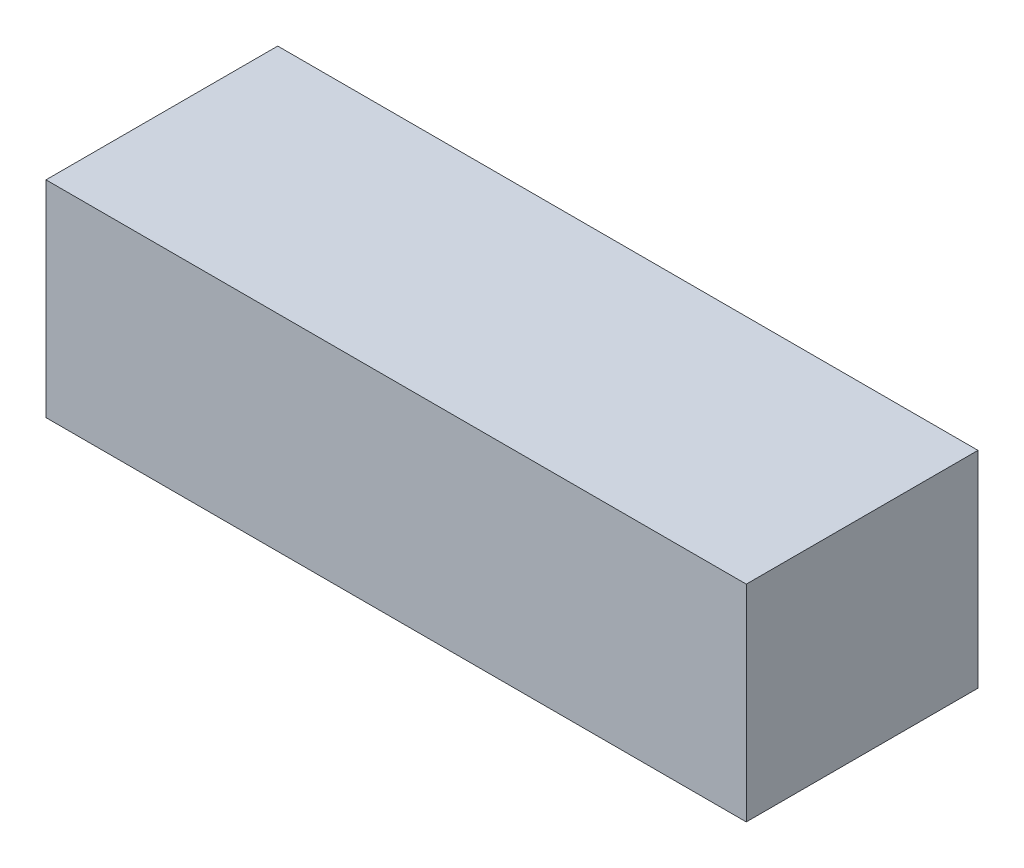
ISO-10303-21;
HEADER;
FILE_DESCRIPTION(('STEP AP214'),'2;1');
FILE_NAME('part.step','',(''),(''),'','','');
FILE_SCHEMA(('AUTOMOTIVE_DESIGN { 1 0 10303 214 1 1 1 1 }'));
ENDSEC;
DATA;
#1=APPLICATION_CONTEXT('core data for automotive mechanical design processes');
#2=APPLICATION_PROTOCOL_DEFINITION('international standard','automotive_design',2000,#1);
#3=PRODUCT_CONTEXT('',#1,'mechanical');
#4=PRODUCT('Part','Part','',(#3));
#5=PRODUCT_RELATED_PRODUCT_CATEGORY('part','',(#4));
#6=PRODUCT_DEFINITION_FORMATION('','',#4);
#7=PRODUCT_DEFINITION_CONTEXT('part definition',#1,'design');
#8=PRODUCT_DEFINITION('design','',#6,#7);
#9=PRODUCT_DEFINITION_SHAPE('','',#8);
#10=(LENGTH_UNIT() NAMED_UNIT(*) SI_UNIT(.MILLI.,.METRE.));
#11=(NAMED_UNIT(*) PLANE_ANGLE_UNIT() SI_UNIT($,.RADIAN.));
#12=(NAMED_UNIT(*) SI_UNIT($,.STERADIAN.) SOLID_ANGLE_UNIT());
#13=UNCERTAINTY_MEASURE_WITH_UNIT(LENGTH_MEASURE(1.E-05),#10,'distance_accuracy_value','');
#14=(GEOMETRIC_REPRESENTATION_CONTEXT(3) GLOBAL_UNCERTAINTY_ASSIGNED_CONTEXT((#13)) GLOBAL_UNIT_ASSIGNED_CONTEXT((#10,
#11,#12)) REPRESENTATION_CONTEXT('',''));
#15=CARTESIAN_POINT('',(0.,0.,0.));
#16=DIRECTION('',(0.,0.,1.));
#17=DIRECTION('',(1.,0.,0.));
#18=AXIS2_PLACEMENT_3D('',#15,#16,#17);
#19=CARTESIAN_POINT('',(-68.,20.,45.));
#20=DIRECTION('',(1.,0.,0.));
#21=DIRECTION('',(0.,0.,-1.));
#22=AXIS2_PLACEMENT_3D('',#19,#20,#21);
#23=PLANE('',#22);
#24=DIRECTION('',(0.,-1.,0.));
#25=VECTOR('',#24,1.);
#26=CARTESIAN_POINT('',(-68.,20.,0.));
#27=LINE('',#26,#25);
#28=CARTESIAN_POINT('',(-68.,20.,0.));
#29=VERTEX_POINT('',#28);
#30=CARTESIAN_POINT('',(-68.,-20.,0.));
#31=VERTEX_POINT('',#30);
#32=EDGE_CURVE('E96',#29,#31,#27,.T.);
#33=ORIENTED_EDGE('',*,*,#32,.T.);
#34=DIRECTION('',(0.,0.,-1.));
#35=VECTOR('',#34,1.);
#36=CARTESIAN_POINT('',(-68.,-20.,45.));
#37=LINE('',#36,#35);
#38=CARTESIAN_POINT('',(-68.,-20.,45.));
#39=VERTEX_POINT('',#38);
#40=EDGE_CURVE('E11',#39,#31,#37,.T.);
#41=ORIENTED_EDGE('',*,*,#40,.F.);
#42=DIRECTION('',(0.,-1.,0.));
#43=VECTOR('',#42,1.);
#44=CARTESIAN_POINT('',(-68.,20.,45.));
#45=LINE('',#44,#43);
#46=CARTESIAN_POINT('',(-68.,20.,45.));
#47=VERTEX_POINT('',#46);
#48=EDGE_CURVE('E84',#47,#39,#45,.T.);
#49=ORIENTED_EDGE('',*,*,#48,.F.);
#50=DIRECTION('',(0.,0.,-1.));
#51=VECTOR('',#50,1.);
#52=CARTESIAN_POINT('',(-68.,20.,45.));
#53=LINE('',#52,#51);
#54=EDGE_CURVE('E92',#47,#29,#53,.T.);
#55=ORIENTED_EDGE('',*,*,#54,.T.);
#56=EDGE_LOOP('',(#33,#41,#49,#55));
#57=FACE_BOUND('',#56,.T.);
#58=ADVANCED_FACE('F33',(#57),#23,.F.);
#59=CARTESIAN_POINT('',(-68.,-20.,45.));
#60=DIRECTION('',(0.,1.,0.));
#61=DIRECTION('',(0.,0.,1.));
#62=AXIS2_PLACEMENT_3D('',#59,#60,#61);
#63=PLANE('',#62);
#64=DIRECTION('',(1.,0.,0.));
#65=VECTOR('',#64,1.);
#66=CARTESIAN_POINT('',(-68.,-20.,0.));
#67=LINE('',#66,#65);
#68=CARTESIAN_POINT('',(68.,-20.,0.));
#69=VERTEX_POINT('',#68);
#70=EDGE_CURVE('E88',#31,#69,#67,.T.);
#71=ORIENTED_EDGE('',*,*,#70,.T.);
#72=DIRECTION('',(0.,0.,-1.));
#73=VECTOR('',#72,1.);
#74=CARTESIAN_POINT('',(68.,-20.,45.));
#75=LINE('',#74,#73);
#76=CARTESIAN_POINT('',(68.,-20.,45.));
#77=VERTEX_POINT('',#76);
#78=EDGE_CURVE('E41',#77,#69,#75,.T.);
#79=ORIENTED_EDGE('',*,*,#78,.F.);
#80=DIRECTION('',(1.,0.,0.));
#81=VECTOR('',#80,1.);
#82=CARTESIAN_POINT('',(-68.,-20.,45.));
#83=LINE('',#82,#81);
#84=EDGE_CURVE('E79',#39,#77,#83,.T.);
#85=ORIENTED_EDGE('',*,*,#84,.F.);
#86=ORIENTED_EDGE('',*,*,#40,.T.);
#87=EDGE_LOOP('',(#71,#79,#85,#86));
#88=FACE_BOUND('',#87,.T.);
#89=ADVANCED_FACE('F87',(#88),#63,.F.);
#90=CARTESIAN_POINT('',(68.,20.,45.));
#91=DIRECTION('',(-1.,0.,0.));
#92=DIRECTION('',(0.,-1.,0.));
#93=AXIS2_PLACEMENT_3D('',#90,#91,#92);
#94=PLANE('',#93);
#95=DIRECTION('',(0.,1.,0.));
#96=VECTOR('',#95,1.);
#97=CARTESIAN_POINT('',(68.,20.,0.));
#98=LINE('',#97,#96);
#99=CARTESIAN_POINT('',(68.,20.,0.));
#100=VERTEX_POINT('',#99);
#101=EDGE_CURVE('E66',#69,#100,#98,.T.);
#102=ORIENTED_EDGE('',*,*,#101,.T.);
#103=DIRECTION('',(0.,0.,-1.));
#104=VECTOR('',#103,1.);
#105=CARTESIAN_POINT('',(68.,20.,45.));
#106=LINE('',#105,#104);
#107=CARTESIAN_POINT('',(68.,20.,45.));
#108=VERTEX_POINT('',#107);
#109=EDGE_CURVE('E89',#108,#100,#106,.T.);
#110=ORIENTED_EDGE('',*,*,#109,.F.);
#111=DIRECTION('',(0.,1.,0.));
#112=VECTOR('',#111,1.);
#113=CARTESIAN_POINT('',(68.,20.,45.));
#114=LINE('',#113,#112);
#115=EDGE_CURVE('E82',#77,#108,#114,.T.);
#116=ORIENTED_EDGE('',*,*,#115,.F.);
#117=ORIENTED_EDGE('',*,*,#78,.T.);
#118=EDGE_LOOP('',(#102,#110,#116,#117));
#119=FACE_BOUND('',#118,.T.);
#120=ADVANCED_FACE('F90',(#119),#94,.F.);
#121=CARTESIAN_POINT('',(-68.,20.,45.));
#122=DIRECTION('',(0.,-1.,0.));
#123=DIRECTION('',(0.,0.,-1.));
#124=AXIS2_PLACEMENT_3D('',#121,#122,#123);
#125=PLANE('',#124);
#126=DIRECTION('',(-1.,0.,0.));
#127=VECTOR('',#126,1.);
#128=CARTESIAN_POINT('',(-68.,20.,0.));
#129=LINE('',#128,#127);
#130=EDGE_CURVE('E72',#100,#29,#129,.T.);
#131=ORIENTED_EDGE('',*,*,#130,.T.);
#132=ORIENTED_EDGE('',*,*,#54,.F.);
#133=DIRECTION('',(-1.,0.,0.));
#134=VECTOR('',#133,1.);
#135=CARTESIAN_POINT('',(-68.,20.,45.));
#136=LINE('',#135,#134);
#137=EDGE_CURVE('E49',#108,#47,#136,.T.);
#138=ORIENTED_EDGE('',*,*,#137,.F.);
#139=ORIENTED_EDGE('',*,*,#109,.T.);
#140=EDGE_LOOP('',(#131,#132,#138,#139));
#141=FACE_BOUND('',#140,.T.);
#142=ADVANCED_FACE('F103',(#141),#125,.F.);
#143=CARTESIAN_POINT('',(0.,0.,45.));
#144=DIRECTION('',(0.,0.,1.));
#145=DIRECTION('',(1.,0.,0.));
#146=AXIS2_PLACEMENT_3D('',#143,#144,#145);
#147=PLANE('',#146);
#148=ORIENTED_EDGE('',*,*,#48,.T.);
#149=ORIENTED_EDGE('',*,*,#84,.T.);
#150=ORIENTED_EDGE('',*,*,#115,.T.);
#151=ORIENTED_EDGE('',*,*,#137,.T.);
#152=EDGE_LOOP('',(#148,#149,#150,#151));
#153=FACE_BOUND('',#152,.T.);
#154=ADVANCED_FACE('F80',(#153),#147,.T.);
#155=CARTESIAN_POINT('',(0.,0.,0.));
#156=DIRECTION('',(0.,0.,1.));
#157=DIRECTION('',(1.,0.,0.));
#158=AXIS2_PLACEMENT_3D('',#155,#156,#157);
#159=PLANE('',#158);
#160=ORIENTED_EDGE('',*,*,#32,.F.);
#161=ORIENTED_EDGE('',*,*,#130,.F.);
#162=ORIENTED_EDGE('',*,*,#101,.F.);
#163=ORIENTED_EDGE('',*,*,#70,.F.);
#164=EDGE_LOOP('',(#160,#161,#162,#163));
#165=FACE_BOUND('',#164,.T.);
#166=ADVANCED_FACE('F106',(#165),#159,.F.);
#167=CLOSED_SHELL('',(#58,#89,#120,#142,#154,#166));
#168=MANIFOLD_SOLID_BREP('B2',#167);
#169=ADVANCED_BREP_SHAPE_REPRESENTATION('',(#18,#168),#14);
#170=SHAPE_DEFINITION_REPRESENTATION(#9,#169);
ENDSEC;
END-ISO-10303-21;
